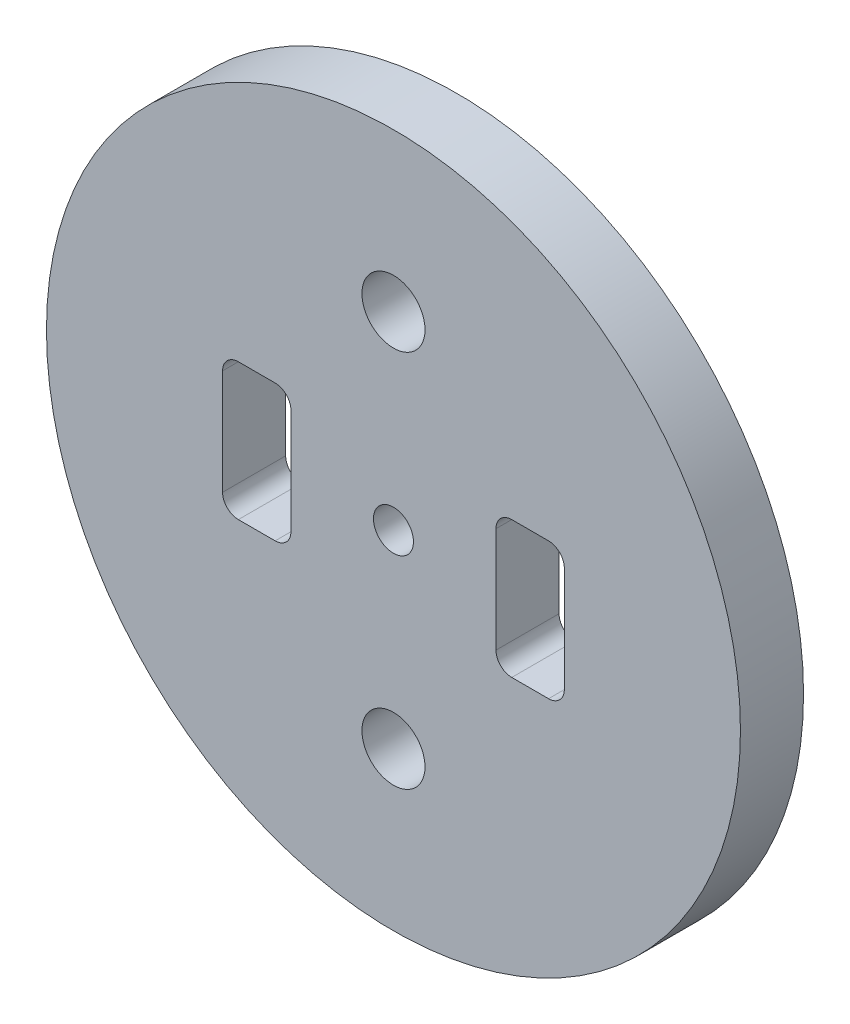
ISO-10303-21;
HEADER;
FILE_DESCRIPTION(('STEP AP214'),'2;1');
FILE_NAME('part.step','',(''),(''),'','','');
FILE_SCHEMA(('AUTOMOTIVE_DESIGN { 1 0 10303 214 1 1 1 1 }'));
ENDSEC;
DATA;
#1=APPLICATION_CONTEXT('core data for automotive mechanical design processes');
#2=APPLICATION_PROTOCOL_DEFINITION('international standard','automotive_design',2000,#1);
#3=PRODUCT_CONTEXT('',#1,'mechanical');
#4=PRODUCT('Part','Part','',(#3));
#5=PRODUCT_RELATED_PRODUCT_CATEGORY('part','',(#4));
#6=PRODUCT_DEFINITION_FORMATION('','',#4);
#7=PRODUCT_DEFINITION_CONTEXT('part definition',#1,'design');
#8=PRODUCT_DEFINITION('design','',#6,#7);
#9=PRODUCT_DEFINITION_SHAPE('','',#8);
#10=(LENGTH_UNIT() NAMED_UNIT(*) SI_UNIT(.MILLI.,.METRE.));
#11=(NAMED_UNIT(*) PLANE_ANGLE_UNIT() SI_UNIT($,.RADIAN.));
#12=(NAMED_UNIT(*) SI_UNIT($,.STERADIAN.) SOLID_ANGLE_UNIT());
#13=UNCERTAINTY_MEASURE_WITH_UNIT(LENGTH_MEASURE(1.E-05),#10,'distance_accuracy_value','');
#14=(GEOMETRIC_REPRESENTATION_CONTEXT(3) GLOBAL_UNCERTAINTY_ASSIGNED_CONTEXT((#13)) GLOBAL_UNIT_ASSIGNED_CONTEXT((#10,
#11,#12)) REPRESENTATION_CONTEXT('',''));
#15=CARTESIAN_POINT('',(0.,0.,0.));
#16=DIRECTION('',(0.,0.,1.));
#17=DIRECTION('',(1.,0.,0.));
#18=AXIS2_PLACEMENT_3D('',#15,#16,#17);
#19=CARTESIAN_POINT('',(215.7478079135,241.9520199932,3.));
#20=DIRECTION('',(0.,0.,1.));
#21=DIRECTION('',(1.,0.,0.));
#22=AXIS2_PLACEMENT_3D('',#19,#20,#21);
#23=PLANE('',#22);
#24=DIRECTION('',(0.,-1.,0.));
#25=VECTOR('',#24,1.);
#26=CARTESIAN_POINT('',(220.6228079135,244.4520199932,3.));
#27=LINE('',#26,#25);
#28=CARTESIAN_POINT('',(220.6228079135,244.4520199932,3.));
#29=VERTEX_POINT('',#28);
#30=CARTESIAN_POINT('',(220.6228079135,239.4520199932,3.));
#31=VERTEX_POINT('',#30);
#32=EDGE_CURVE('E213',#29,#31,#27,.T.);
#33=ORIENTED_EDGE('',*,*,#32,.F.);
#34=CARTESIAN_POINT('',(221.3728079135,244.4520199932,3.));
#35=DIRECTION('',(0.,0.,1.));
#36=DIRECTION('',(1.,0.,0.));
#37=AXIS2_PLACEMENT_3D('',#34,#35,#36);
#38=CIRCLE('',#37,0.750000000000001);
#39=CARTESIAN_POINT('',(221.3728079135,245.2020199932,3.));
#40=VERTEX_POINT('',#39);
#41=EDGE_CURVE('E211',#40,#29,#38,.T.);
#42=ORIENTED_EDGE('',*,*,#41,.F.);
#43=DIRECTION('',(-1.,0.,0.));
#44=VECTOR('',#43,1.);
#45=CARTESIAN_POINT('',(223.1228079135,245.2020199932,3.));
#46=LINE('',#45,#44);
#47=CARTESIAN_POINT('',(223.1228079135,245.2020199932,3.));
#48=VERTEX_POINT('',#47);
#49=EDGE_CURVE('E227',#48,#40,#46,.T.);
#50=ORIENTED_EDGE('',*,*,#49,.F.);
#51=CARTESIAN_POINT('',(223.1228079135,244.4520199932,3.));
#52=DIRECTION('',(0.,0.,1.));
#53=DIRECTION('',(1.,0.,0.));
#54=AXIS2_PLACEMENT_3D('',#51,#52,#53);
#55=CIRCLE('',#54,0.750000000000001);
#56=CARTESIAN_POINT('',(223.8728079135,244.4520199932,3.));
#57=VERTEX_POINT('',#56);
#58=EDGE_CURVE('E224',#57,#48,#55,.T.);
#59=ORIENTED_EDGE('',*,*,#58,.F.);
#60=DIRECTION('',(0.,1.,0.));
#61=VECTOR('',#60,1.);
#62=CARTESIAN_POINT('',(223.8728079135,239.4520199932,3.));
#63=LINE('',#62,#61);
#64=CARTESIAN_POINT('',(223.8728079135,239.4520199932,3.));
#65=VERTEX_POINT('',#64);
#66=EDGE_CURVE('E222',#65,#57,#63,.T.);
#67=ORIENTED_EDGE('',*,*,#66,.F.);
#68=CARTESIAN_POINT('',(223.1228079135,239.4520199932,3.));
#69=DIRECTION('',(0.,0.,1.));
#70=DIRECTION('',(1.,0.,0.));
#71=AXIS2_PLACEMENT_3D('',#68,#69,#70);
#72=CIRCLE('',#71,0.750000000000001);
#73=CARTESIAN_POINT('',(223.1228079135,238.7020199932,3.));
#74=VERTEX_POINT('',#73);
#75=EDGE_CURVE('E220',#74,#65,#72,.T.);
#76=ORIENTED_EDGE('',*,*,#75,.F.);
#77=DIRECTION('',(1.,0.,0.));
#78=VECTOR('',#77,1.);
#79=CARTESIAN_POINT('',(221.3728079135,238.7020199932,3.));
#80=LINE('',#79,#78);
#81=CARTESIAN_POINT('',(221.3728079135,238.7020199932,3.));
#82=VERTEX_POINT('',#81);
#83=EDGE_CURVE('E218',#82,#74,#80,.T.);
#84=ORIENTED_EDGE('',*,*,#83,.F.);
#85=CARTESIAN_POINT('',(221.3728079135,239.4520199932,3.));
#86=DIRECTION('',(0.,0.,1.));
#87=DIRECTION('',(1.,0.,0.));
#88=AXIS2_PLACEMENT_3D('',#85,#86,#87);
#89=CIRCLE('',#88,0.750000000000001);
#90=EDGE_CURVE('E216',#31,#82,#89,.T.);
#91=ORIENTED_EDGE('',*,*,#90,.F.);
#92=EDGE_LOOP('',(#33,#42,#50,#59,#67,#76,#84,#91));
#93=FACE_BOUND('',#92,.T.);
#94=CARTESIAN_POINT('',(215.7478079135,232.9520199932,3.));
#95=DIRECTION('',(0.,0.,1.));
#96=DIRECTION('',(1.,0.,0.));
#97=AXIS2_PLACEMENT_3D('',#94,#95,#96);
#98=CIRCLE('',#97,1.5);
#99=CARTESIAN_POINT('',(217.2478079135,232.9520199932,3.));
#100=VERTEX_POINT('',#99);
#101=EDGE_CURVE('E276',#100,#100,#98,.T.);
#102=ORIENTED_EDGE('',*,*,#101,.F.);
#103=EDGE_LOOP('',(#102));
#104=FACE_BOUND('',#103,.T.);
#105=CARTESIAN_POINT('',(215.7478079135,241.9520199932,3.));
#106=DIRECTION('',(0.,0.,1.));
#107=DIRECTION('',(1.,0.,0.));
#108=AXIS2_PLACEMENT_3D('',#105,#106,#107);
#109=CIRCLE('',#108,16.5);
#110=CARTESIAN_POINT('',(232.2478079135,241.9520199932,3.));
#111=VERTEX_POINT('',#110);
#112=EDGE_CURVE('E11',#111,#111,#109,.T.);
#113=ORIENTED_EDGE('',*,*,#112,.T.);
#114=EDGE_LOOP('',(#113));
#115=FACE_BOUND('',#114,.T.);
#116=CARTESIAN_POINT('',(215.7478079135,241.9520199932,3.));
#117=DIRECTION('',(0.,0.,1.));
#118=DIRECTION('',(1.,0.,0.));
#119=AXIS2_PLACEMENT_3D('',#116,#117,#118);
#120=CIRCLE('',#119,0.950000000000006);
#121=CARTESIAN_POINT('',(216.6978079135,241.9520199932,3.));
#122=VERTEX_POINT('',#121);
#123=EDGE_CURVE('E282',#122,#122,#120,.T.);
#124=ORIENTED_EDGE('',*,*,#123,.F.);
#125=EDGE_LOOP('',(#124));
#126=FACE_BOUND('',#125,.T.);
#127=CARTESIAN_POINT('',(215.7478079135,250.9520199932,3.));
#128=DIRECTION('',(0.,0.,1.));
#129=DIRECTION('',(1.,0.,0.));
#130=AXIS2_PLACEMENT_3D('',#127,#128,#129);
#131=CIRCLE('',#130,1.5);
#132=CARTESIAN_POINT('',(217.2478079135,250.9520199932,3.));
#133=VERTEX_POINT('',#132);
#134=EDGE_CURVE('E270',#133,#133,#131,.T.);
#135=ORIENTED_EDGE('',*,*,#134,.F.);
#136=EDGE_LOOP('',(#135));
#137=FACE_BOUND('',#136,.T.);
#138=DIRECTION('',(-1.,0.,0.));
#139=VECTOR('',#138,1.);
#140=CARTESIAN_POINT('',(208.3728079135,245.2020199932,3.));
#141=LINE('',#140,#139);
#142=CARTESIAN_POINT('',(210.1228079135,245.2020199932,3.));
#143=VERTEX_POINT('',#142);
#144=CARTESIAN_POINT('',(208.3728079135,245.2020199932,3.));
#145=VERTEX_POINT('',#144);
#146=EDGE_CURVE('E154',#143,#145,#141,.T.);
#147=ORIENTED_EDGE('',*,*,#146,.F.);
#148=CARTESIAN_POINT('',(210.1228079135,244.4520199932,3.));
#149=DIRECTION('',(0.,0.,1.));
#150=DIRECTION('',(1.,0.,0.));
#151=AXIS2_PLACEMENT_3D('',#148,#149,#150);
#152=CIRCLE('',#151,0.750000000000001);
#153=CARTESIAN_POINT('',(210.8728079135,244.4520199932,3.));
#154=VERTEX_POINT('',#153);
#155=EDGE_CURVE('E146',#154,#143,#152,.T.);
#156=ORIENTED_EDGE('',*,*,#155,.F.);
#157=DIRECTION('',(0.,1.,0.));
#158=VECTOR('',#157,1.);
#159=CARTESIAN_POINT('',(210.8728079135,244.4520199932,3.));
#160=LINE('',#159,#158);
#161=CARTESIAN_POINT('',(210.8728079135,239.4520199932,3.));
#162=VERTEX_POINT('',#161);
#163=EDGE_CURVE('E179',#162,#154,#160,.T.);
#164=ORIENTED_EDGE('',*,*,#163,.F.);
#165=CARTESIAN_POINT('',(210.1228079135,239.4520199932,3.));
#166=DIRECTION('',(0.,0.,1.));
#167=DIRECTION('',(1.,0.,0.));
#168=AXIS2_PLACEMENT_3D('',#165,#166,#167);
#169=CIRCLE('',#168,0.750000000000001);
#170=CARTESIAN_POINT('',(210.1228079135,238.7020199932,3.));
#171=VERTEX_POINT('',#170);
#172=EDGE_CURVE('E177',#171,#162,#169,.T.);
#173=ORIENTED_EDGE('',*,*,#172,.F.);
#174=DIRECTION('',(1.,0.,0.));
#175=VECTOR('',#174,1.);
#176=CARTESIAN_POINT('',(210.1228079135,238.7020199932,3.));
#177=LINE('',#176,#175);
#178=CARTESIAN_POINT('',(208.3728079135,238.7020199932,3.));
#179=VERTEX_POINT('',#178);
#180=EDGE_CURVE('E175',#179,#171,#177,.T.);
#181=ORIENTED_EDGE('',*,*,#180,.F.);
#182=CARTESIAN_POINT('',(208.3728079135,239.4520199932,3.));
#183=DIRECTION('',(0.,0.,1.));
#184=DIRECTION('',(1.,0.,0.));
#185=AXIS2_PLACEMENT_3D('',#182,#183,#184);
#186=CIRCLE('',#185,0.750000000000237);
#187=CARTESIAN_POINT('',(207.6228079135,239.4520199932,3.));
#188=VERTEX_POINT('',#187);
#189=EDGE_CURVE('E173',#188,#179,#186,.T.);
#190=ORIENTED_EDGE('',*,*,#189,.F.);
#191=DIRECTION('',(0.,-1.,0.));
#192=VECTOR('',#191,1.);
#193=CARTESIAN_POINT('',(207.6228079135,239.4520199932,3.));
#194=LINE('',#193,#192);
#195=CARTESIAN_POINT('',(207.6228079135,244.4520199932,3.));
#196=VERTEX_POINT('',#195);
#197=EDGE_CURVE('E169',#196,#188,#194,.T.);
#198=ORIENTED_EDGE('',*,*,#197,.F.);
#199=CARTESIAN_POINT('',(208.3728079135,244.4520199932,3.));
#200=DIRECTION('',(0.,0.,1.));
#201=DIRECTION('',(1.,0.,0.));
#202=AXIS2_PLACEMENT_3D('',#199,#200,#201);
#203=CIRCLE('',#202,0.750000000000001);
#204=EDGE_CURVE('E167',#145,#196,#203,.T.);
#205=ORIENTED_EDGE('',*,*,#204,.F.);
#206=EDGE_LOOP('',(#147,#156,#164,#173,#181,#190,#198,#205));
#207=FACE_BOUND('',#206,.T.);
#208=ADVANCED_FACE('F33',(#93,#104,#115,#126,#137,#207),#23,.T.);
#209=CARTESIAN_POINT('',(215.7478079135,241.9520199932,0.));
#210=DIRECTION('',(0.,0.,1.));
#211=DIRECTION('',(1.,0.,0.));
#212=AXIS2_PLACEMENT_3D('',#209,#210,#211);
#213=PLANE('',#212);
#214=CARTESIAN_POINT('',(221.3728079135,244.4520199932,0.));
#215=DIRECTION('',(0.,0.,1.));
#216=DIRECTION('',(1.,0.,0.));
#217=AXIS2_PLACEMENT_3D('',#214,#215,#216);
#218=CIRCLE('',#217,0.750000000000001);
#219=CARTESIAN_POINT('',(221.3728079135,245.2020199932,0.));
#220=VERTEX_POINT('',#219);
#221=CARTESIAN_POINT('',(220.6228079135,244.4520199932,0.));
#222=VERTEX_POINT('',#221);
#223=EDGE_CURVE('E162',#220,#222,#218,.T.);
#224=ORIENTED_EDGE('',*,*,#223,.T.);
#225=DIRECTION('',(0.,-1.,0.));
#226=VECTOR('',#225,1.);
#227=CARTESIAN_POINT('',(220.6228079135,244.4520199932,0.));
#228=LINE('',#227,#226);
#229=CARTESIAN_POINT('',(220.6228079135,239.4520199932,0.));
#230=VERTEX_POINT('',#229);
#231=EDGE_CURVE('E232',#222,#230,#228,.T.);
#232=ORIENTED_EDGE('',*,*,#231,.T.);
#233=CARTESIAN_POINT('',(221.3728079135,239.4520199932,0.));
#234=DIRECTION('',(0.,0.,1.));
#235=DIRECTION('',(1.,0.,0.));
#236=AXIS2_PLACEMENT_3D('',#233,#234,#235);
#237=CIRCLE('',#236,0.750000000000001);
#238=CARTESIAN_POINT('',(221.3728079135,238.7020199932,0.));
#239=VERTEX_POINT('',#238);
#240=EDGE_CURVE('E235',#230,#239,#237,.T.);
#241=ORIENTED_EDGE('',*,*,#240,.T.);
#242=DIRECTION('',(1.,0.,0.));
#243=VECTOR('',#242,1.);
#244=CARTESIAN_POINT('',(221.3728079135,238.7020199932,0.));
#245=LINE('',#244,#243);
#246=CARTESIAN_POINT('',(223.1228079135,238.7020199932,0.));
#247=VERTEX_POINT('',#246);
#248=EDGE_CURVE('E238',#239,#247,#245,.T.);
#249=ORIENTED_EDGE('',*,*,#248,.T.);
#250=CARTESIAN_POINT('',(223.1228079135,239.4520199932,0.));
#251=DIRECTION('',(0.,0.,1.));
#252=DIRECTION('',(1.,0.,0.));
#253=AXIS2_PLACEMENT_3D('',#250,#251,#252);
#254=CIRCLE('',#253,0.750000000000001);
#255=CARTESIAN_POINT('',(223.8728079135,239.4520199932,0.));
#256=VERTEX_POINT('',#255);
#257=EDGE_CURVE('E241',#247,#256,#254,.T.);
#258=ORIENTED_EDGE('',*,*,#257,.T.);
#259=DIRECTION('',(0.,1.,0.));
#260=VECTOR('',#259,1.);
#261=CARTESIAN_POINT('',(223.8728079135,239.4520199932,0.));
#262=LINE('',#261,#260);
#263=CARTESIAN_POINT('',(223.8728079135,244.4520199932,0.));
#264=VERTEX_POINT('',#263);
#265=EDGE_CURVE('E244',#256,#264,#262,.T.);
#266=ORIENTED_EDGE('',*,*,#265,.T.);
#267=CARTESIAN_POINT('',(223.1228079135,244.4520199932,0.));
#268=DIRECTION('',(0.,0.,1.));
#269=DIRECTION('',(1.,0.,0.));
#270=AXIS2_PLACEMENT_3D('',#267,#268,#269);
#271=CIRCLE('',#270,0.750000000000001);
#272=CARTESIAN_POINT('',(223.1228079135,245.2020199932,0.));
#273=VERTEX_POINT('',#272);
#274=EDGE_CURVE('E247',#264,#273,#271,.T.);
#275=ORIENTED_EDGE('',*,*,#274,.T.);
#276=DIRECTION('',(-1.,0.,0.));
#277=VECTOR('',#276,1.);
#278=CARTESIAN_POINT('',(223.1228079135,245.2020199932,0.));
#279=LINE('',#278,#277);
#280=EDGE_CURVE('E214',#273,#220,#279,.T.);
#281=ORIENTED_EDGE('',*,*,#280,.T.);
#282=EDGE_LOOP('',(#224,#232,#241,#249,#258,#266,#275,#281));
#283=FACE_BOUND('',#282,.T.);
#284=CARTESIAN_POINT('',(215.7478079135,232.9520199932,0.));
#285=DIRECTION('',(0.,0.,1.));
#286=DIRECTION('',(1.,0.,0.));
#287=AXIS2_PLACEMENT_3D('',#284,#285,#286);
#288=CIRCLE('',#287,1.5);
#289=CARTESIAN_POINT('',(217.2478079135,232.9520199932,0.));
#290=VERTEX_POINT('',#289);
#291=EDGE_CURVE('E273',#290,#290,#288,.T.);
#292=ORIENTED_EDGE('',*,*,#291,.T.);
#293=EDGE_LOOP('',(#292));
#294=FACE_BOUND('',#293,.T.);
#295=CARTESIAN_POINT('',(215.7478079135,241.9520199932,0.));
#296=DIRECTION('',(0.,0.,1.));
#297=DIRECTION('',(1.,0.,0.));
#298=AXIS2_PLACEMENT_3D('',#295,#296,#297);
#299=CIRCLE('',#298,16.5);
#300=CARTESIAN_POINT('',(232.2478079135,241.9520199932,0.));
#301=VERTEX_POINT('',#300);
#302=EDGE_CURVE('E37',#301,#301,#299,.T.);
#303=ORIENTED_EDGE('',*,*,#302,.F.);
#304=EDGE_LOOP('',(#303));
#305=FACE_BOUND('',#304,.T.);
#306=CARTESIAN_POINT('',(215.7478079135,241.9520199932,0.));
#307=DIRECTION('',(0.,0.,1.));
#308=DIRECTION('',(1.,0.,0.));
#309=AXIS2_PLACEMENT_3D('',#306,#307,#308);
#310=CIRCLE('',#309,0.950000000000006);
#311=CARTESIAN_POINT('',(216.6978079135,241.9520199932,0.));
#312=VERTEX_POINT('',#311);
#313=EDGE_CURVE('E279',#312,#312,#310,.T.);
#314=ORIENTED_EDGE('',*,*,#313,.T.);
#315=EDGE_LOOP('',(#314));
#316=FACE_BOUND('',#315,.T.);
#317=CARTESIAN_POINT('',(215.7478079135,250.9520199932,0.));
#318=DIRECTION('',(0.,0.,1.));
#319=DIRECTION('',(1.,0.,0.));
#320=AXIS2_PLACEMENT_3D('',#317,#318,#319);
#321=CIRCLE('',#320,1.5);
#322=CARTESIAN_POINT('',(217.2478079135,250.9520199932,0.));
#323=VERTEX_POINT('',#322);
#324=EDGE_CURVE('E269',#323,#323,#321,.T.);
#325=ORIENTED_EDGE('',*,*,#324,.T.);
#326=EDGE_LOOP('',(#325));
#327=FACE_BOUND('',#326,.T.);
#328=CARTESIAN_POINT('',(210.1228079135,244.4520199932,0.));
#329=DIRECTION('',(0.,0.,1.));
#330=DIRECTION('',(1.,0.,0.));
#331=AXIS2_PLACEMENT_3D('',#328,#329,#330);
#332=CIRCLE('',#331,0.750000000000001);
#333=CARTESIAN_POINT('',(210.8728079135,244.4520199932,0.));
#334=VERTEX_POINT('',#333);
#335=CARTESIAN_POINT('',(210.1228079135,245.2020199932,0.));
#336=VERTEX_POINT('',#335);
#337=EDGE_CURVE('E56',#334,#336,#332,.T.);
#338=ORIENTED_EDGE('',*,*,#337,.T.);
#339=DIRECTION('',(-1.,0.,0.));
#340=VECTOR('',#339,1.);
#341=CARTESIAN_POINT('',(208.3728079135,245.2020199932,0.));
#342=LINE('',#341,#340);
#343=CARTESIAN_POINT('',(208.3728079135,245.2020199932,0.));
#344=VERTEX_POINT('',#343);
#345=EDGE_CURVE('E161',#336,#344,#342,.T.);
#346=ORIENTED_EDGE('',*,*,#345,.T.);
#347=CARTESIAN_POINT('',(208.3728079135,244.4520199932,0.));
#348=DIRECTION('',(0.,0.,1.));
#349=DIRECTION('',(1.,0.,0.));
#350=AXIS2_PLACEMENT_3D('',#347,#348,#349);
#351=CIRCLE('',#350,0.750000000000001);
#352=CARTESIAN_POINT('',(207.6228079135,244.4520199932,0.));
#353=VERTEX_POINT('',#352);
#354=EDGE_CURVE('E183',#344,#353,#351,.T.);
#355=ORIENTED_EDGE('',*,*,#354,.T.);
#356=DIRECTION('',(0.,-1.,0.));
#357=VECTOR('',#356,1.);
#358=CARTESIAN_POINT('',(207.6228079135,239.4520199932,0.));
#359=LINE('',#358,#357);
#360=CARTESIAN_POINT('',(207.6228079135,239.4520199932,0.));
#361=VERTEX_POINT('',#360);
#362=EDGE_CURVE('E186',#353,#361,#359,.T.);
#363=ORIENTED_EDGE('',*,*,#362,.T.);
#364=CARTESIAN_POINT('',(208.3728079135,239.4520199932,0.));
#365=DIRECTION('',(0.,0.,1.));
#366=DIRECTION('',(1.,0.,0.));
#367=AXIS2_PLACEMENT_3D('',#364,#365,#366);
#368=CIRCLE('',#367,0.750000000000237);
#369=CARTESIAN_POINT('',(208.3728079135,238.7020199932,0.));
#370=VERTEX_POINT('',#369);
#371=EDGE_CURVE('E189',#361,#370,#368,.T.);
#372=ORIENTED_EDGE('',*,*,#371,.T.);
#373=DIRECTION('',(1.,0.,0.));
#374=VECTOR('',#373,1.);
#375=CARTESIAN_POINT('',(210.1228079135,238.7020199932,0.));
#376=LINE('',#375,#374);
#377=CARTESIAN_POINT('',(210.1228079135,238.7020199932,0.));
#378=VERTEX_POINT('',#377);
#379=EDGE_CURVE('E192',#370,#378,#376,.T.);
#380=ORIENTED_EDGE('',*,*,#379,.T.);
#381=CARTESIAN_POINT('',(210.1228079135,239.4520199932,0.));
#382=DIRECTION('',(0.,0.,1.));
#383=DIRECTION('',(1.,0.,0.));
#384=AXIS2_PLACEMENT_3D('',#381,#382,#383);
#385=CIRCLE('',#384,0.750000000000001);
#386=CARTESIAN_POINT('',(210.8728079135,239.4520199932,0.));
#387=VERTEX_POINT('',#386);
#388=EDGE_CURVE('E195',#378,#387,#385,.T.);
#389=ORIENTED_EDGE('',*,*,#388,.T.);
#390=DIRECTION('',(0.,1.,0.));
#391=VECTOR('',#390,1.);
#392=CARTESIAN_POINT('',(210.8728079135,244.4520199932,0.));
#393=LINE('',#392,#391);
#394=EDGE_CURVE('E155',#387,#334,#393,.T.);
#395=ORIENTED_EDGE('',*,*,#394,.T.);
#396=EDGE_LOOP('',(#338,#346,#355,#363,#372,#380,#389,#395));
#397=FACE_BOUND('',#396,.T.);
#398=ADVANCED_FACE('F288',(#283,#294,#305,#316,#327,#397),#213,.F.);
#399=CARTESIAN_POINT('',(215.7478079135,241.9520199932,3.));
#400=DIRECTION('',(0.,0.,-1.));
#401=DIRECTION('',(-1.,0.,0.));
#402=AXIS2_PLACEMENT_3D('',#399,#400,#401);
#403=CYLINDRICAL_SURFACE('',#402,16.5);
#404=ORIENTED_EDGE('',*,*,#112,.F.);
#405=EDGE_LOOP('',(#404));
#406=FACE_BOUND('',#405,.T.);
#407=ORIENTED_EDGE('',*,*,#302,.T.);
#408=EDGE_LOOP('',(#407));
#409=FACE_BOUND('',#408,.T.);
#410=ADVANCED_FACE('F35',(#406,#409),#403,.T.);
#411=CARTESIAN_POINT('',(215.7478079135,241.9520199932,3.));
#412=DIRECTION('',(0.,0.,-1.));
#413=DIRECTION('',(-1.,0.,0.));
#414=AXIS2_PLACEMENT_3D('',#411,#412,#413);
#415=CYLINDRICAL_SURFACE('',#414,0.950000000000006);
#416=ORIENTED_EDGE('',*,*,#123,.T.);
#417=EDGE_LOOP('',(#416));
#418=FACE_BOUND('',#417,.T.);
#419=ORIENTED_EDGE('',*,*,#313,.F.);
#420=EDGE_LOOP('',(#419));
#421=FACE_BOUND('',#420,.T.);
#422=ADVANCED_FACE('F291',(#418,#421),#415,.F.);
#423=CARTESIAN_POINT('',(215.7478079135,232.9520199932,3.));
#424=DIRECTION('',(0.,0.,-1.));
#425=DIRECTION('',(-1.,0.,0.));
#426=AXIS2_PLACEMENT_3D('',#423,#424,#425);
#427=CYLINDRICAL_SURFACE('',#426,1.5);
#428=ORIENTED_EDGE('',*,*,#101,.T.);
#429=EDGE_LOOP('',(#428));
#430=FACE_BOUND('',#429,.T.);
#431=ORIENTED_EDGE('',*,*,#291,.F.);
#432=EDGE_LOOP('',(#431));
#433=FACE_BOUND('',#432,.T.);
#434=ADVANCED_FACE('F293',(#430,#433),#427,.F.);
#435=CARTESIAN_POINT('',(215.7478079135,250.9520199932,3.));
#436=DIRECTION('',(0.,0.,-1.));
#437=DIRECTION('',(-1.,0.,0.));
#438=AXIS2_PLACEMENT_3D('',#435,#436,#437);
#439=CYLINDRICAL_SURFACE('',#438,1.5);
#440=ORIENTED_EDGE('',*,*,#134,.T.);
#441=EDGE_LOOP('',(#440));
#442=FACE_BOUND('',#441,.T.);
#443=ORIENTED_EDGE('',*,*,#324,.F.);
#444=EDGE_LOOP('',(#443));
#445=FACE_BOUND('',#444,.T.);
#446=ADVANCED_FACE('F300',(#442,#445),#439,.F.);
#447=CARTESIAN_POINT('',(221.3728079135,244.4520199932,3.));
#448=DIRECTION('',(0.,0.,-1.));
#449=DIRECTION('',(-1.,0.,0.));
#450=AXIS2_PLACEMENT_3D('',#447,#448,#449);
#451=CYLINDRICAL_SURFACE('',#450,0.750000000000001);
#452=ORIENTED_EDGE('',*,*,#223,.F.);
#453=DIRECTION('',(0.,0.,-1.));
#454=VECTOR('',#453,1.);
#455=CARTESIAN_POINT('',(221.3728079135,245.2020199932,3.));
#456=LINE('',#455,#454);
#457=EDGE_CURVE('E229',#40,#220,#456,.T.);
#458=ORIENTED_EDGE('',*,*,#457,.F.);
#459=ORIENTED_EDGE('',*,*,#41,.T.);
#460=DIRECTION('',(0.,0.,-1.));
#461=VECTOR('',#460,1.);
#462=CARTESIAN_POINT('',(220.6228079135,244.4520199932,3.));
#463=LINE('',#462,#461);
#464=EDGE_CURVE('E266',#29,#222,#463,.T.);
#465=ORIENTED_EDGE('',*,*,#464,.T.);
#466=EDGE_LOOP('',(#452,#458,#459,#465));
#467=FACE_BOUND('',#466,.T.);
#468=ADVANCED_FACE('F325',(#467),#451,.F.);
#469=CARTESIAN_POINT('',(220.6228079135,244.4520199932,3.));
#470=DIRECTION('',(1.,0.,0.));
#471=DIRECTION('',(0.,0.,-1.));
#472=AXIS2_PLACEMENT_3D('',#469,#470,#471);
#473=PLANE('',#472);
#474=ORIENTED_EDGE('',*,*,#231,.F.);
#475=ORIENTED_EDGE('',*,*,#464,.F.);
#476=ORIENTED_EDGE('',*,*,#32,.T.);
#477=DIRECTION('',(0.,0.,-1.));
#478=VECTOR('',#477,1.);
#479=CARTESIAN_POINT('',(220.6228079135,239.4520199932,3.));
#480=LINE('',#479,#478);
#481=EDGE_CURVE('E264',#31,#230,#480,.T.);
#482=ORIENTED_EDGE('',*,*,#481,.T.);
#483=EDGE_LOOP('',(#474,#475,#476,#482));
#484=FACE_BOUND('',#483,.T.);
#485=ADVANCED_FACE('F387',(#484),#473,.T.);
#486=CARTESIAN_POINT('',(221.3728079135,239.4520199932,3.));
#487=DIRECTION('',(0.,0.,-1.));
#488=DIRECTION('',(-1.,0.,0.));
#489=AXIS2_PLACEMENT_3D('',#486,#487,#488);
#490=CYLINDRICAL_SURFACE('',#489,0.750000000000001);
#491=ORIENTED_EDGE('',*,*,#240,.F.);
#492=ORIENTED_EDGE('',*,*,#481,.F.);
#493=ORIENTED_EDGE('',*,*,#90,.T.);
#494=DIRECTION('',(0.,0.,-1.));
#495=VECTOR('',#494,1.);
#496=CARTESIAN_POINT('',(221.3728079135,238.7020199932,3.));
#497=LINE('',#496,#495);
#498=EDGE_CURVE('E262',#82,#239,#497,.T.);
#499=ORIENTED_EDGE('',*,*,#498,.T.);
#500=EDGE_LOOP('',(#491,#492,#493,#499));
#501=FACE_BOUND('',#500,.T.);
#502=ADVANCED_FACE('F383',(#501),#490,.F.);
#503=CARTESIAN_POINT('',(221.3728079135,238.7020199932,3.));
#504=DIRECTION('',(0.,1.,0.));
#505=DIRECTION('',(0.,0.,1.));
#506=AXIS2_PLACEMENT_3D('',#503,#504,#505);
#507=PLANE('',#506);
#508=ORIENTED_EDGE('',*,*,#248,.F.);
#509=ORIENTED_EDGE('',*,*,#498,.F.);
#510=ORIENTED_EDGE('',*,*,#83,.T.);
#511=DIRECTION('',(0.,0.,-1.));
#512=VECTOR('',#511,1.);
#513=CARTESIAN_POINT('',(223.1228079135,238.7020199932,3.));
#514=LINE('',#513,#512);
#515=EDGE_CURVE('E260',#74,#247,#514,.T.);
#516=ORIENTED_EDGE('',*,*,#515,.T.);
#517=EDGE_LOOP('',(#508,#509,#510,#516));
#518=FACE_BOUND('',#517,.T.);
#519=ADVANCED_FACE('F379',(#518),#507,.T.);
#520=CARTESIAN_POINT('',(223.1228079135,239.4520199932,3.));
#521=DIRECTION('',(0.,0.,-1.));
#522=DIRECTION('',(-1.,0.,0.));
#523=AXIS2_PLACEMENT_3D('',#520,#521,#522);
#524=CYLINDRICAL_SURFACE('',#523,0.750000000000001);
#525=ORIENTED_EDGE('',*,*,#257,.F.);
#526=ORIENTED_EDGE('',*,*,#515,.F.);
#527=ORIENTED_EDGE('',*,*,#75,.T.);
#528=DIRECTION('',(0.,0.,-1.));
#529=VECTOR('',#528,1.);
#530=CARTESIAN_POINT('',(223.8728079135,239.4520199932,3.));
#531=LINE('',#530,#529);
#532=EDGE_CURVE('E258',#65,#256,#531,.T.);
#533=ORIENTED_EDGE('',*,*,#532,.T.);
#534=EDGE_LOOP('',(#525,#526,#527,#533));
#535=FACE_BOUND('',#534,.T.);
#536=ADVANCED_FACE('F375',(#535),#524,.F.);
#537=CARTESIAN_POINT('',(223.8728079135,239.4520199932,3.));
#538=DIRECTION('',(-1.,0.,0.));
#539=DIRECTION('',(0.,0.,1.));
#540=AXIS2_PLACEMENT_3D('',#537,#538,#539);
#541=PLANE('',#540);
#542=ORIENTED_EDGE('',*,*,#265,.F.);
#543=ORIENTED_EDGE('',*,*,#532,.F.);
#544=ORIENTED_EDGE('',*,*,#66,.T.);
#545=DIRECTION('',(0.,0.,-1.));
#546=VECTOR('',#545,1.);
#547=CARTESIAN_POINT('',(223.8728079135,244.4520199932,3.));
#548=LINE('',#547,#546);
#549=EDGE_CURVE('E256',#57,#264,#548,.T.);
#550=ORIENTED_EDGE('',*,*,#549,.T.);
#551=EDGE_LOOP('',(#542,#543,#544,#550));
#552=FACE_BOUND('',#551,.T.);
#553=ADVANCED_FACE('F371',(#552),#541,.T.);
#554=CARTESIAN_POINT('',(223.1228079135,244.4520199932,3.));
#555=DIRECTION('',(0.,0.,-1.));
#556=DIRECTION('',(-1.,0.,0.));
#557=AXIS2_PLACEMENT_3D('',#554,#555,#556);
#558=CYLINDRICAL_SURFACE('',#557,0.750000000000001);
#559=ORIENTED_EDGE('',*,*,#274,.F.);
#560=ORIENTED_EDGE('',*,*,#549,.F.);
#561=ORIENTED_EDGE('',*,*,#58,.T.);
#562=DIRECTION('',(0.,0.,-1.));
#563=VECTOR('',#562,1.);
#564=CARTESIAN_POINT('',(223.1228079135,245.2020199932,3.));
#565=LINE('',#564,#563);
#566=EDGE_CURVE('E254',#48,#273,#565,.T.);
#567=ORIENTED_EDGE('',*,*,#566,.T.);
#568=EDGE_LOOP('',(#559,#560,#561,#567));
#569=FACE_BOUND('',#568,.T.);
#570=ADVANCED_FACE('F367',(#569),#558,.F.);
#571=CARTESIAN_POINT('',(223.1228079135,245.2020199932,3.));
#572=DIRECTION('',(0.,-1.,0.));
#573=DIRECTION('',(0.,0.,-1.));
#574=AXIS2_PLACEMENT_3D('',#571,#572,#573);
#575=PLANE('',#574);
#576=ORIENTED_EDGE('',*,*,#280,.F.);
#577=ORIENTED_EDGE('',*,*,#566,.F.);
#578=ORIENTED_EDGE('',*,*,#49,.T.);
#579=ORIENTED_EDGE('',*,*,#457,.T.);
#580=EDGE_LOOP('',(#576,#577,#578,#579));
#581=FACE_BOUND('',#580,.T.);
#582=ADVANCED_FACE('F364',(#581),#575,.T.);
#583=CARTESIAN_POINT('',(210.1228079135,244.4520199932,3.));
#584=DIRECTION('',(0.,0.,-1.));
#585=DIRECTION('',(-1.,0.,0.));
#586=AXIS2_PLACEMENT_3D('',#583,#584,#585);
#587=CYLINDRICAL_SURFACE('',#586,0.750000000000001);
#588=ORIENTED_EDGE('',*,*,#337,.F.);
#589=DIRECTION('',(0.,0.,-1.));
#590=VECTOR('',#589,1.);
#591=CARTESIAN_POINT('',(210.8728079135,244.4520199932,3.));
#592=LINE('',#591,#590);
#593=EDGE_CURVE('E150',#154,#334,#592,.T.);
#594=ORIENTED_EDGE('',*,*,#593,.F.);
#595=ORIENTED_EDGE('',*,*,#155,.T.);
#596=DIRECTION('',(0.,0.,-1.));
#597=VECTOR('',#596,1.);
#598=CARTESIAN_POINT('',(210.1228079135,245.2020199932,3.));
#599=LINE('',#598,#597);
#600=EDGE_CURVE('E149',#143,#336,#599,.T.);
#601=ORIENTED_EDGE('',*,*,#600,.T.);
#602=EDGE_LOOP('',(#588,#594,#595,#601));
#603=FACE_BOUND('',#602,.T.);
#604=ADVANCED_FACE('F148',(#603),#587,.F.);
#605=CARTESIAN_POINT('',(208.3728079135,245.2020199932,3.));
#606=DIRECTION('',(0.,-1.,0.));
#607=DIRECTION('',(0.,0.,-1.));
#608=AXIS2_PLACEMENT_3D('',#605,#606,#607);
#609=PLANE('',#608);
#610=ORIENTED_EDGE('',*,*,#345,.F.);
#611=ORIENTED_EDGE('',*,*,#600,.F.);
#612=ORIENTED_EDGE('',*,*,#146,.T.);
#613=DIRECTION('',(0.,0.,-1.));
#614=VECTOR('',#613,1.);
#615=CARTESIAN_POINT('',(208.3728079135,245.2020199932,3.));
#616=LINE('',#615,#614);
#617=EDGE_CURVE('E163',#145,#344,#616,.T.);
#618=ORIENTED_EDGE('',*,*,#617,.T.);
#619=EDGE_LOOP('',(#610,#611,#612,#618));
#620=FACE_BOUND('',#619,.T.);
#621=ADVANCED_FACE('F158',(#620),#609,.T.);
#622=CARTESIAN_POINT('',(208.3728079135,244.4520199932,3.));
#623=DIRECTION('',(0.,0.,-1.));
#624=DIRECTION('',(-1.,0.,0.));
#625=AXIS2_PLACEMENT_3D('',#622,#623,#624);
#626=CYLINDRICAL_SURFACE('',#625,0.750000000000001);
#627=ORIENTED_EDGE('',*,*,#354,.F.);
#628=ORIENTED_EDGE('',*,*,#617,.F.);
#629=ORIENTED_EDGE('',*,*,#204,.T.);
#630=DIRECTION('',(0.,0.,-1.));
#631=VECTOR('',#630,1.);
#632=CARTESIAN_POINT('',(207.6228079135,244.4520199932,3.));
#633=LINE('',#632,#631);
#634=EDGE_CURVE('E208',#196,#353,#633,.T.);
#635=ORIENTED_EDGE('',*,*,#634,.T.);
#636=EDGE_LOOP('',(#627,#628,#629,#635));
#637=FACE_BOUND('',#636,.T.);
#638=ADVANCED_FACE('F351',(#637),#626,.F.);
#639=CARTESIAN_POINT('',(207.6228079135,239.4520199932,3.));
#640=DIRECTION('',(1.,0.,0.));
#641=DIRECTION('',(0.,0.,-1.));
#642=AXIS2_PLACEMENT_3D('',#639,#640,#641);
#643=PLANE('',#642);
#644=ORIENTED_EDGE('',*,*,#362,.F.);
#645=ORIENTED_EDGE('',*,*,#634,.F.);
#646=ORIENTED_EDGE('',*,*,#197,.T.);
#647=DIRECTION('',(0.,0.,-1.));
#648=VECTOR('',#647,1.);
#649=CARTESIAN_POINT('',(207.6228079135,239.4520199932,3.));
#650=LINE('',#649,#648);
#651=EDGE_CURVE('E206',#188,#361,#650,.T.);
#652=ORIENTED_EDGE('',*,*,#651,.T.);
#653=EDGE_LOOP('',(#644,#645,#646,#652));
#654=FACE_BOUND('',#653,.T.);
#655=ADVANCED_FACE('F348',(#654),#643,.T.);
#656=CARTESIAN_POINT('',(208.3728079135,239.4520199932,3.));
#657=DIRECTION('',(0.,0.,-1.));
#658=DIRECTION('',(-1.,0.,0.));
#659=AXIS2_PLACEMENT_3D('',#656,#657,#658);
#660=CYLINDRICAL_SURFACE('',#659,0.750000000000237);
#661=ORIENTED_EDGE('',*,*,#371,.F.);
#662=ORIENTED_EDGE('',*,*,#651,.F.);
#663=ORIENTED_EDGE('',*,*,#189,.T.);
#664=DIRECTION('',(0.,0.,-1.));
#665=VECTOR('',#664,1.);
#666=CARTESIAN_POINT('',(208.3728079135,238.7020199932,3.));
#667=LINE('',#666,#665);
#668=EDGE_CURVE('E204',#179,#370,#667,.T.);
#669=ORIENTED_EDGE('',*,*,#668,.T.);
#670=EDGE_LOOP('',(#661,#662,#663,#669));
#671=FACE_BOUND('',#670,.T.);
#672=ADVANCED_FACE('F343',(#671),#660,.F.);
#673=CARTESIAN_POINT('',(210.1228079135,238.7020199932,3.));
#674=DIRECTION('',(0.,1.,0.));
#675=DIRECTION('',(0.,0.,1.));
#676=AXIS2_PLACEMENT_3D('',#673,#674,#675);
#677=PLANE('',#676);
#678=ORIENTED_EDGE('',*,*,#379,.F.);
#679=ORIENTED_EDGE('',*,*,#668,.F.);
#680=ORIENTED_EDGE('',*,*,#180,.T.);
#681=DIRECTION('',(0.,0.,-1.));
#682=VECTOR('',#681,1.);
#683=CARTESIAN_POINT('',(210.1228079135,238.7020199932,3.));
#684=LINE('',#683,#682);
#685=EDGE_CURVE('E202',#171,#378,#684,.T.);
#686=ORIENTED_EDGE('',*,*,#685,.T.);
#687=EDGE_LOOP('',(#678,#679,#680,#686));
#688=FACE_BOUND('',#687,.T.);
#689=ADVANCED_FACE('F339',(#688),#677,.T.);
#690=CARTESIAN_POINT('',(210.1228079135,239.4520199932,3.));
#691=DIRECTION('',(0.,0.,-1.));
#692=DIRECTION('',(-1.,0.,0.));
#693=AXIS2_PLACEMENT_3D('',#690,#691,#692);
#694=CYLINDRICAL_SURFACE('',#693,0.750000000000001);
#695=ORIENTED_EDGE('',*,*,#388,.F.);
#696=ORIENTED_EDGE('',*,*,#685,.F.);
#697=ORIENTED_EDGE('',*,*,#172,.T.);
#698=DIRECTION('',(0.,0.,-1.));
#699=VECTOR('',#698,1.);
#700=CARTESIAN_POINT('',(210.8728079135,239.4520199932,3.));
#701=LINE('',#700,#699);
#702=EDGE_CURVE('E48',#162,#387,#701,.T.);
#703=ORIENTED_EDGE('',*,*,#702,.T.);
#704=EDGE_LOOP('',(#695,#696,#697,#703));
#705=FACE_BOUND('',#704,.T.);
#706=ADVANCED_FACE('F336',(#705),#694,.F.);
#707=CARTESIAN_POINT('',(210.8728079135,244.4520199932,3.));
#708=DIRECTION('',(-1.,0.,0.));
#709=DIRECTION('',(0.,0.,1.));
#710=AXIS2_PLACEMENT_3D('',#707,#708,#709);
#711=PLANE('',#710);
#712=ORIENTED_EDGE('',*,*,#394,.F.);
#713=ORIENTED_EDGE('',*,*,#702,.F.);
#714=ORIENTED_EDGE('',*,*,#163,.T.);
#715=ORIENTED_EDGE('',*,*,#593,.T.);
#716=EDGE_LOOP('',(#712,#713,#714,#715));
#717=FACE_BOUND('',#716,.T.);
#718=ADVANCED_FACE('F330',(#717),#711,.T.);
#719=CLOSED_SHELL('',(#208,#398,#410,#422,#434,#446,#468,#485,#502,#519,#536,#553,#570,#582,
#604,#621,#638,#655,#672,#689,#706,#718));
#720=MANIFOLD_SOLID_BREP('B2',#719);
#721=ADVANCED_BREP_SHAPE_REPRESENTATION('',(#18,#720),#14);
#722=SHAPE_DEFINITION_REPRESENTATION(#9,#721);
ENDSEC;
END-ISO-10303-21;
